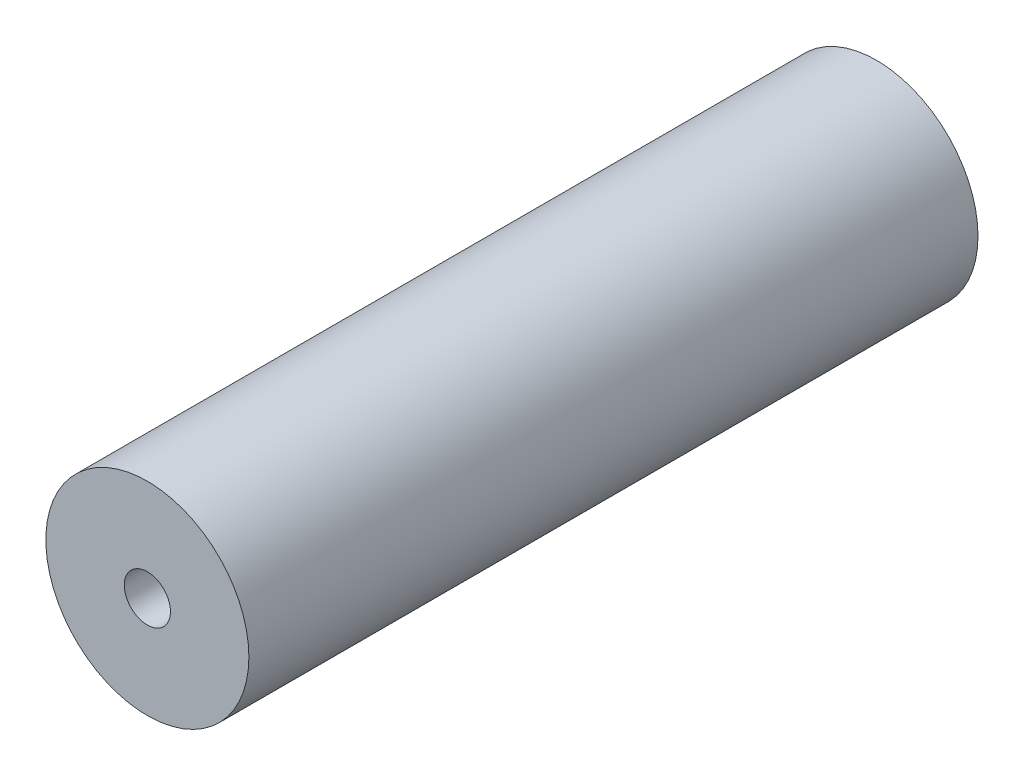
ISO-10303-21;
HEADER;
FILE_DESCRIPTION(('STEP AP214'),'2;1');
FILE_NAME('part.step','',(''),(''),'','','');
FILE_SCHEMA(('AUTOMOTIVE_DESIGN { 1 0 10303 214 1 1 1 1 }'));
ENDSEC;
DATA;
#1=APPLICATION_CONTEXT('core data for automotive mechanical design processes');
#2=APPLICATION_PROTOCOL_DEFINITION('international standard','automotive_design',2000,#1);
#3=PRODUCT_CONTEXT('',#1,'mechanical');
#4=PRODUCT('Part','Part','',(#3));
#5=PRODUCT_RELATED_PRODUCT_CATEGORY('part','',(#4));
#6=PRODUCT_DEFINITION_FORMATION('','',#4);
#7=PRODUCT_DEFINITION_CONTEXT('part definition',#1,'design');
#8=PRODUCT_DEFINITION('design','',#6,#7);
#9=PRODUCT_DEFINITION_SHAPE('','',#8);
#10=(LENGTH_UNIT() NAMED_UNIT(*) SI_UNIT(.MILLI.,.METRE.));
#11=(NAMED_UNIT(*) PLANE_ANGLE_UNIT() SI_UNIT($,.RADIAN.));
#12=(NAMED_UNIT(*) SI_UNIT($,.STERADIAN.) SOLID_ANGLE_UNIT());
#13=UNCERTAINTY_MEASURE_WITH_UNIT(LENGTH_MEASURE(1.E-05),#10,'distance_accuracy_value','');
#14=(GEOMETRIC_REPRESENTATION_CONTEXT(3) GLOBAL_UNCERTAINTY_ASSIGNED_CONTEXT((#13)) GLOBAL_UNIT_ASSIGNED_CONTEXT((#10,
#11,#12)) REPRESENTATION_CONTEXT('',''));
#15=CARTESIAN_POINT('',(0.,0.,0.));
#16=DIRECTION('',(0.,0.,1.));
#17=DIRECTION('',(1.,0.,0.));
#18=AXIS2_PLACEMENT_3D('',#15,#16,#17);
#19=CARTESIAN_POINT('',(0.,0.,39.5));
#20=DIRECTION('',(0.,0.,1.));
#21=DIRECTION('',(1.,0.,0.));
#22=AXIS2_PLACEMENT_3D('',#19,#20,#21);
#23=PLANE('',#22);
#24=CARTESIAN_POINT('',(0.,0.,39.5));
#25=DIRECTION('',(0.,0.,1.));
#26=DIRECTION('',(1.,0.,0.));
#27=AXIS2_PLACEMENT_3D('',#24,#25,#26);
#28=CIRCLE('',#27,5.5);
#29=CARTESIAN_POINT('',(5.5,0.,39.5));
#30=VERTEX_POINT('',#29);
#31=EDGE_CURVE('E10',#30,#30,#28,.T.);
#32=ORIENTED_EDGE('',*,*,#31,.T.);
#33=EDGE_LOOP('',(#32));
#34=FACE_BOUND('',#33,.T.);
#35=CARTESIAN_POINT('',(0.,0.,39.5));
#36=DIRECTION('',(0.,0.,1.));
#37=DIRECTION('',(1.,0.,0.));
#38=AXIS2_PLACEMENT_3D('',#35,#36,#37);
#39=CIRCLE('',#38,1.25);
#40=CARTESIAN_POINT('',(1.25,0.,39.5));
#41=VERTEX_POINT('',#40);
#42=EDGE_CURVE('E42',#41,#41,#39,.T.);
#43=ORIENTED_EDGE('',*,*,#42,.F.);
#44=EDGE_LOOP('',(#43));
#45=FACE_BOUND('',#44,.T.);
#46=ADVANCED_FACE('F31',(#34,#45),#23,.T.);
#47=CARTESIAN_POINT('',(0.,0.,0.));
#48=DIRECTION('',(0.,0.,1.));
#49=DIRECTION('',(1.,0.,0.));
#50=AXIS2_PLACEMENT_3D('',#47,#48,#49);
#51=PLANE('',#50);
#52=CARTESIAN_POINT('',(0.,0.,0.));
#53=DIRECTION('',(0.,0.,1.));
#54=DIRECTION('',(1.,0.,0.));
#55=AXIS2_PLACEMENT_3D('',#52,#53,#54);
#56=CIRCLE('',#55,5.5);
#57=CARTESIAN_POINT('',(5.5,0.,0.));
#58=VERTEX_POINT('',#57);
#59=EDGE_CURVE('E35',#58,#58,#56,.T.);
#60=ORIENTED_EDGE('',*,*,#59,.F.);
#61=EDGE_LOOP('',(#60));
#62=FACE_BOUND('',#61,.T.);
#63=CARTESIAN_POINT('',(0.,0.,0.));
#64=DIRECTION('',(0.,0.,1.));
#65=DIRECTION('',(1.,0.,0.));
#66=AXIS2_PLACEMENT_3D('',#63,#64,#65);
#67=CIRCLE('',#66,1.25);
#68=CARTESIAN_POINT('',(1.25,0.,0.));
#69=VERTEX_POINT('',#68);
#70=EDGE_CURVE('E44',#69,#69,#67,.T.);
#71=ORIENTED_EDGE('',*,*,#70,.T.);
#72=EDGE_LOOP('',(#71));
#73=FACE_BOUND('',#72,.T.);
#74=ADVANCED_FACE('F54',(#62,#73),#51,.F.);
#75=CARTESIAN_POINT('',(0.,0.,39.5));
#76=DIRECTION('',(0.,0.,-1.));
#77=DIRECTION('',(-1.,0.,0.));
#78=AXIS2_PLACEMENT_3D('',#75,#76,#77);
#79=CYLINDRICAL_SURFACE('',#78,5.5);
#80=ORIENTED_EDGE('',*,*,#31,.F.);
#81=EDGE_LOOP('',(#80));
#82=FACE_BOUND('',#81,.T.);
#83=ORIENTED_EDGE('',*,*,#59,.T.);
#84=EDGE_LOOP('',(#83));
#85=FACE_BOUND('',#84,.T.);
#86=ADVANCED_FACE('F33',(#82,#85),#79,.T.);
#87=CARTESIAN_POINT('',(0.,0.,39.5));
#88=DIRECTION('',(0.,0.,-1.));
#89=DIRECTION('',(-1.,0.,0.));
#90=AXIS2_PLACEMENT_3D('',#87,#88,#89);
#91=CYLINDRICAL_SURFACE('',#90,1.25);
#92=ORIENTED_EDGE('',*,*,#42,.T.);
#93=EDGE_LOOP('',(#92));
#94=FACE_BOUND('',#93,.T.);
#95=ORIENTED_EDGE('',*,*,#70,.F.);
#96=EDGE_LOOP('',(#95));
#97=FACE_BOUND('',#96,.T.);
#98=ADVANCED_FACE('F50',(#94,#97),#91,.F.);
#99=CLOSED_SHELL('',(#46,#74,#86,#98));
#100=MANIFOLD_SOLID_BREP('B2',#99);
#101=ADVANCED_BREP_SHAPE_REPRESENTATION('',(#18,#100),#14);
#102=SHAPE_DEFINITION_REPRESENTATION(#9,#101);
ENDSEC;
END-ISO-10303-21;
